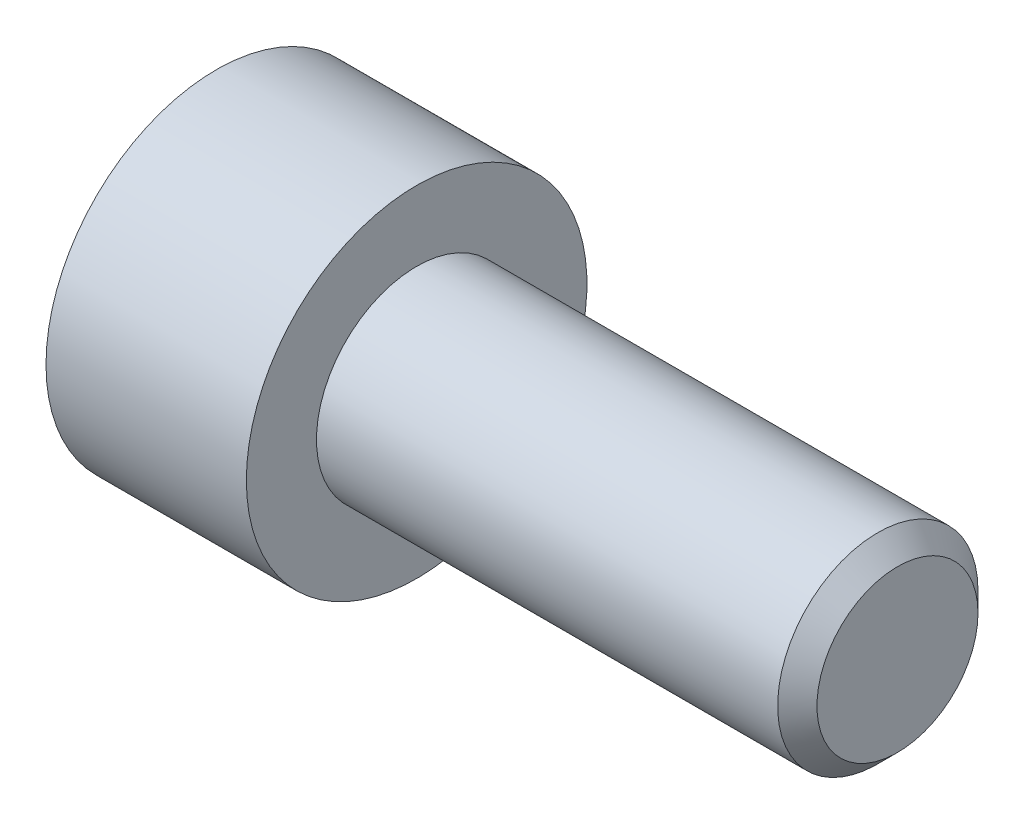
ISO-10303-21;
HEADER;
FILE_DESCRIPTION(('STEP AP214'),'2;1');
FILE_NAME('part.step','',(''),(''),'','','');
FILE_SCHEMA(('AUTOMOTIVE_DESIGN { 1 0 10303 214 1 1 1 1 }'));
ENDSEC;
DATA;
#1=APPLICATION_CONTEXT('core data for automotive mechanical design processes');
#2=APPLICATION_PROTOCOL_DEFINITION('international standard','automotive_design',2000,#1);
#3=PRODUCT_CONTEXT('',#1,'mechanical');
#4=PRODUCT('Part','Part','',(#3));
#5=PRODUCT_RELATED_PRODUCT_CATEGORY('part','',(#4));
#6=PRODUCT_DEFINITION_FORMATION('','',#4);
#7=PRODUCT_DEFINITION_CONTEXT('part definition',#1,'design');
#8=PRODUCT_DEFINITION('design','',#6,#7);
#9=PRODUCT_DEFINITION_SHAPE('','',#8);
#10=(LENGTH_UNIT() NAMED_UNIT(*) SI_UNIT(.MILLI.,.METRE.));
#11=(NAMED_UNIT(*) PLANE_ANGLE_UNIT() SI_UNIT($,.RADIAN.));
#12=(NAMED_UNIT(*) SI_UNIT($,.STERADIAN.) SOLID_ANGLE_UNIT());
#13=UNCERTAINTY_MEASURE_WITH_UNIT(LENGTH_MEASURE(1.E-05),#10,'distance_accuracy_value','');
#14=(GEOMETRIC_REPRESENTATION_CONTEXT(3) GLOBAL_UNCERTAINTY_ASSIGNED_CONTEXT((#13)) GLOBAL_UNIT_ASSIGNED_CONTEXT((#10,
#11,#12)) REPRESENTATION_CONTEXT('',''));
#15=CARTESIAN_POINT('',(0.,0.,0.));
#16=DIRECTION('',(0.,0.,1.));
#17=DIRECTION('',(1.,0.,0.));
#18=AXIS2_PLACEMENT_3D('',#15,#16,#17);
#19=CARTESIAN_POINT('',(0.,0.,0.));
#20=DIRECTION('',(-1.,0.,0.));
#21=DIRECTION('',(0.,0.,1.));
#22=AXIS2_PLACEMENT_3D('',#19,#20,#21);
#23=CYLINDRICAL_SURFACE('',#22,4.25);
#24=CARTESIAN_POINT('',(0.,0.,0.));
#25=DIRECTION('',(-1.,0.,0.));
#26=DIRECTION('',(0.,0.,1.));
#27=AXIS2_PLACEMENT_3D('',#24,#25,#26);
#28=CIRCLE('',#27,4.25);
#29=CARTESIAN_POINT('',(0.,0.,4.25));
#30=VERTEX_POINT('',#29);
#31=EDGE_CURVE('E149',#30,#30,#28,.T.);
#32=ORIENTED_EDGE('',*,*,#31,.T.);
#33=EDGE_LOOP('',(#32));
#34=FACE_BOUND('',#33,.T.);
#35=CARTESIAN_POINT('',(-5.,0.,0.));
#36=DIRECTION('',(-1.,0.,0.));
#37=DIRECTION('',(0.,0.,1.));
#38=AXIS2_PLACEMENT_3D('',#35,#36,#37);
#39=CIRCLE('',#38,4.25);
#40=CARTESIAN_POINT('',(-5.,0.,4.25));
#41=VERTEX_POINT('',#40);
#42=EDGE_CURVE('E146',#41,#41,#39,.T.);
#43=ORIENTED_EDGE('',*,*,#42,.F.);
#44=EDGE_LOOP('',(#43));
#45=FACE_BOUND('',#44,.T.);
#46=ADVANCED_FACE('F33',(#34,#45),#23,.T.);
#47=CARTESIAN_POINT('',(0.,4.25,0.));
#48=DIRECTION('',(1.,0.,0.));
#49=DIRECTION('',(0.,0.,-1.));
#50=AXIS2_PLACEMENT_3D('',#47,#48,#49);
#51=PLANE('',#50);
#52=CARTESIAN_POINT('',(0.,0.,0.));
#53=DIRECTION('',(1.,0.,0.));
#54=DIRECTION('',(0.,0.,-1.));
#55=AXIS2_PLACEMENT_3D('',#52,#53,#54);
#56=CIRCLE('',#55,2.5);
#57=CARTESIAN_POINT('',(0.,0.,-2.5));
#58=VERTEX_POINT('',#57);
#59=EDGE_CURVE('E138',#58,#58,#56,.T.);
#60=ORIENTED_EDGE('',*,*,#59,.F.);
#61=EDGE_LOOP('',(#60));
#62=FACE_BOUND('',#61,.T.);
#63=ORIENTED_EDGE('',*,*,#31,.F.);
#64=EDGE_LOOP('',(#63));
#65=FACE_BOUND('',#64,.T.);
#66=ADVANCED_FACE('F166',(#62,#65),#51,.T.);
#67=CARTESIAN_POINT('',(-5.,0.,0.));
#68=DIRECTION('',(-1.,0.,0.));
#69=DIRECTION('',(0.,0.,1.));
#70=AXIS2_PLACEMENT_3D('',#67,#68,#69);
#71=PLANE('',#70);
#72=DIRECTION('',(0.,1.,0.));
#73=VECTOR('',#72,1.);
#74=CARTESIAN_POINT('',(-5.,-1.15470053837925,2.));
#75=LINE('',#74,#73);
#76=CARTESIAN_POINT('',(-5.,-1.15470053837925,2.));
#77=VERTEX_POINT('',#76);
#78=CARTESIAN_POINT('',(-5.,1.15470053837925,2.));
#79=VERTEX_POINT('',#78);
#80=EDGE_CURVE('E48',#77,#79,#75,.T.);
#81=ORIENTED_EDGE('',*,*,#80,.F.);
#82=DIRECTION('',(0.,0.5,0.866025403784439));
#83=VECTOR('',#82,1.);
#84=CARTESIAN_POINT('',(-5.,-2.3094010767585,0.));
#85=LINE('',#84,#83);
#86=CARTESIAN_POINT('',(-5.,-2.3094010767585,0.));
#87=VERTEX_POINT('',#86);
#88=EDGE_CURVE('E134',#87,#77,#85,.T.);
#89=ORIENTED_EDGE('',*,*,#88,.F.);
#90=DIRECTION('',(0.,-0.5,0.866025403784439));
#91=VECTOR('',#90,1.);
#92=CARTESIAN_POINT('',(-5.,-1.15470053837925,-2.));
#93=LINE('',#92,#91);
#94=CARTESIAN_POINT('',(-5.,-1.15470053837925,-2.));
#95=VERTEX_POINT('',#94);
#96=EDGE_CURVE('E132',#95,#87,#93,.T.);
#97=ORIENTED_EDGE('',*,*,#96,.F.);
#98=DIRECTION('',(0.,-1.,0.));
#99=VECTOR('',#98,1.);
#100=CARTESIAN_POINT('',(-5.,1.15470053837925,-2.));
#101=LINE('',#100,#99);
#102=CARTESIAN_POINT('',(-5.,1.15470053837925,-2.));
#103=VERTEX_POINT('',#102);
#104=EDGE_CURVE('E98',#103,#95,#101,.T.);
#105=ORIENTED_EDGE('',*,*,#104,.F.);
#106=DIRECTION('',(0.,-0.5,-0.866025403784439));
#107=VECTOR('',#106,1.);
#108=CARTESIAN_POINT('',(-5.,2.3094010767585,0.));
#109=LINE('',#108,#107);
#110=CARTESIAN_POINT('',(-5.,2.3094010767585,0.));
#111=VERTEX_POINT('',#110);
#112=EDGE_CURVE('E128',#111,#103,#109,.T.);
#113=ORIENTED_EDGE('',*,*,#112,.F.);
#114=DIRECTION('',(0.,0.5,-0.866025403784439));
#115=VECTOR('',#114,1.);
#116=CARTESIAN_POINT('',(-5.,1.15470053837925,2.));
#117=LINE('',#116,#115);
#118=EDGE_CURVE('E124',#79,#111,#117,.T.);
#119=ORIENTED_EDGE('',*,*,#118,.F.);
#120=EDGE_LOOP('',(#81,#89,#97,#105,#113,#119));
#121=FACE_BOUND('',#120,.T.);
#122=ORIENTED_EDGE('',*,*,#42,.T.);
#123=EDGE_LOOP('',(#122));
#124=FACE_BOUND('',#123,.T.);
#125=ADVANCED_FACE('F171',(#121,#124),#71,.T.);
#126=CARTESIAN_POINT('',(12.,0.,0.));
#127=DIRECTION('',(-1.,0.,0.));
#128=DIRECTION('',(0.,0.,1.));
#129=AXIS2_PLACEMENT_3D('',#126,#127,#128);
#130=CYLINDRICAL_SURFACE('',#129,2.5);
#131=CARTESIAN_POINT('',(11.5094999999357,0.,0.));
#132=DIRECTION('',(1.,0.,0.));
#133=DIRECTION('',(0.,0.,-1.));
#134=AXIS2_PLACEMENT_3D('',#131,#132,#133);
#135=CIRCLE('',#134,2.5);
#136=CARTESIAN_POINT('',(11.5094999999357,0.,-2.5));
#137=VERTEX_POINT('',#136);
#138=EDGE_CURVE('E11',#137,#137,#135,.F.);
#139=ORIENTED_EDGE('',*,*,#138,.T.);
#140=EDGE_LOOP('',(#139));
#141=FACE_BOUND('',#140,.T.);
#142=ORIENTED_EDGE('',*,*,#59,.T.);
#143=EDGE_LOOP('',(#142));
#144=FACE_BOUND('',#143,.T.);
#145=ADVANCED_FACE('F178',(#141,#144),#130,.T.);
#146=CARTESIAN_POINT('',(12.,0.,0.));
#147=DIRECTION('',(1.,0.,0.));
#148=DIRECTION('',(0.,0.,-1.));
#149=AXIS2_PLACEMENT_3D('',#146,#147,#148);
#150=PLANE('',#149);
#151=CARTESIAN_POINT('',(12.,0.,0.));
#152=DIRECTION('',(1.,0.,0.));
#153=DIRECTION('',(0.,0.,-1.));
#154=AXIS2_PLACEMENT_3D('',#151,#152,#153);
#155=CIRCLE('',#154,2.00949999999256);
#156=CARTESIAN_POINT('',(12.,0.,-2.00949999999256));
#157=VERTEX_POINT('',#156);
#158=EDGE_CURVE('E41',#157,#157,#155,.T.);
#159=ORIENTED_EDGE('',*,*,#158,.T.);
#160=EDGE_LOOP('',(#159));
#161=FACE_BOUND('',#160,.T.);
#162=ADVANCED_FACE('F154',(#161),#150,.T.);
#163=CARTESIAN_POINT('',(-2.5,-1.15470053837925,2.));
#164=DIRECTION('',(0.,0.,1.));
#165=DIRECTION('',(1.,0.,0.));
#166=AXIS2_PLACEMENT_3D('',#163,#164,#165);
#167=PLANE('',#166);
#168=ORIENTED_EDGE('',*,*,#80,.T.);
#169=DIRECTION('',(-1.,0.,0.));
#170=VECTOR('',#169,1.);
#171=CARTESIAN_POINT('',(-2.5,1.15470053837925,2.));
#172=LINE('',#171,#170);
#173=CARTESIAN_POINT('',(-2.5,1.15470053837925,2.));
#174=VERTEX_POINT('',#173);
#175=EDGE_CURVE('E79',#174,#79,#172,.T.);
#176=ORIENTED_EDGE('',*,*,#175,.F.);
#177=DIRECTION('',(0.,1.,0.));
#178=VECTOR('',#177,1.);
#179=CARTESIAN_POINT('',(-2.5,-1.15470053837925,2.));
#180=LINE('',#179,#178);
#181=CARTESIAN_POINT('',(-2.5,-1.15470053837925,2.));
#182=VERTEX_POINT('',#181);
#183=EDGE_CURVE('E136',#182,#174,#180,.T.);
#184=ORIENTED_EDGE('',*,*,#183,.F.);
#185=DIRECTION('',(-1.,0.,0.));
#186=VECTOR('',#185,1.);
#187=CARTESIAN_POINT('',(-2.5,-1.15470053837925,2.));
#188=LINE('',#187,#186);
#189=EDGE_CURVE('E56',#182,#77,#188,.T.);
#190=ORIENTED_EDGE('',*,*,#189,.T.);
#191=EDGE_LOOP('',(#168,#176,#184,#190));
#192=FACE_BOUND('',#191,.T.);
#193=ADVANCED_FACE('F185',(#192),#167,.F.);
#194=CARTESIAN_POINT('',(-2.5,-2.3094010767585,0.));
#195=DIRECTION('',(0.,-0.866025403784439,0.5));
#196=DIRECTION('',(0.,-0.5,-0.866025403784439));
#197=AXIS2_PLACEMENT_3D('',#194,#195,#196);
#198=PLANE('',#197);
#199=ORIENTED_EDGE('',*,*,#88,.T.);
#200=ORIENTED_EDGE('',*,*,#189,.F.);
#201=DIRECTION('',(0.,0.5,0.866025403784439));
#202=VECTOR('',#201,1.);
#203=CARTESIAN_POINT('',(-2.5,-2.3094010767585,0.));
#204=LINE('',#203,#202);
#205=CARTESIAN_POINT('',(-2.5,-2.3094010767585,0.));
#206=VERTEX_POINT('',#205);
#207=EDGE_CURVE('E110',#206,#182,#204,.T.);
#208=ORIENTED_EDGE('',*,*,#207,.F.);
#209=DIRECTION('',(-1.,0.,0.));
#210=VECTOR('',#209,1.);
#211=CARTESIAN_POINT('',(-2.5,-2.3094010767585,0.));
#212=LINE('',#211,#210);
#213=EDGE_CURVE('E102',#206,#87,#212,.T.);
#214=ORIENTED_EDGE('',*,*,#213,.T.);
#215=EDGE_LOOP('',(#199,#200,#208,#214));
#216=FACE_BOUND('',#215,.T.);
#217=ADVANCED_FACE('F188',(#216),#198,.F.);
#218=CARTESIAN_POINT('',(-2.5,-1.15470053837925,-2.));
#219=DIRECTION('',(0.,-0.866025403784439,-0.5));
#220=DIRECTION('',(0.,0.5,-0.866025403784439));
#221=AXIS2_PLACEMENT_3D('',#218,#219,#220);
#222=PLANE('',#221);
#223=ORIENTED_EDGE('',*,*,#96,.T.);
#224=ORIENTED_EDGE('',*,*,#213,.F.);
#225=DIRECTION('',(0.,-0.5,0.866025403784439));
#226=VECTOR('',#225,1.);
#227=CARTESIAN_POINT('',(-2.5,-1.15470053837925,-2.));
#228=LINE('',#227,#226);
#229=CARTESIAN_POINT('',(-2.5,-1.15470053837925,-2.));
#230=VERTEX_POINT('',#229);
#231=EDGE_CURVE('E106',#230,#206,#228,.T.);
#232=ORIENTED_EDGE('',*,*,#231,.F.);
#233=DIRECTION('',(-1.,0.,0.));
#234=VECTOR('',#233,1.);
#235=CARTESIAN_POINT('',(-2.5,-1.15470053837925,-2.));
#236=LINE('',#235,#234);
#237=EDGE_CURVE('E91',#230,#95,#236,.T.);
#238=ORIENTED_EDGE('',*,*,#237,.T.);
#239=EDGE_LOOP('',(#223,#224,#232,#238));
#240=FACE_BOUND('',#239,.T.);
#241=ADVANCED_FACE('F107',(#240),#222,.F.);
#242=CARTESIAN_POINT('',(-2.5,1.15470053837925,-2.));
#243=DIRECTION('',(0.,0.,-1.));
#244=DIRECTION('',(-1.,0.,0.));
#245=AXIS2_PLACEMENT_3D('',#242,#243,#244);
#246=PLANE('',#245);
#247=ORIENTED_EDGE('',*,*,#104,.T.);
#248=ORIENTED_EDGE('',*,*,#237,.F.);
#249=DIRECTION('',(0.,-1.,0.));
#250=VECTOR('',#249,1.);
#251=CARTESIAN_POINT('',(-2.5,1.15470053837925,-2.));
#252=LINE('',#251,#250);
#253=CARTESIAN_POINT('',(-2.5,1.15470053837925,-2.));
#254=VERTEX_POINT('',#253);
#255=EDGE_CURVE('E95',#254,#230,#252,.T.);
#256=ORIENTED_EDGE('',*,*,#255,.F.);
#257=DIRECTION('',(-1.,0.,0.));
#258=VECTOR('',#257,1.);
#259=CARTESIAN_POINT('',(-2.5,1.15470053837925,-2.));
#260=LINE('',#259,#258);
#261=EDGE_CURVE('E103',#254,#103,#260,.T.);
#262=ORIENTED_EDGE('',*,*,#261,.T.);
#263=EDGE_LOOP('',(#247,#248,#256,#262));
#264=FACE_BOUND('',#263,.T.);
#265=ADVANCED_FACE('F93',(#264),#246,.F.);
#266=CARTESIAN_POINT('',(-2.5,2.3094010767585,0.));
#267=DIRECTION('',(0.,0.866025403784439,-0.5));
#268=DIRECTION('',(0.,0.5,0.866025403784439));
#269=AXIS2_PLACEMENT_3D('',#266,#267,#268);
#270=PLANE('',#269);
#271=ORIENTED_EDGE('',*,*,#112,.T.);
#272=ORIENTED_EDGE('',*,*,#261,.F.);
#273=DIRECTION('',(0.,-0.5,-0.866025403784439));
#274=VECTOR('',#273,1.);
#275=CARTESIAN_POINT('',(-2.5,2.3094010767585,0.));
#276=LINE('',#275,#274);
#277=CARTESIAN_POINT('',(-2.5,2.3094010767585,0.));
#278=VERTEX_POINT('',#277);
#279=EDGE_CURVE('E116',#278,#254,#276,.T.);
#280=ORIENTED_EDGE('',*,*,#279,.F.);
#281=DIRECTION('',(-1.,0.,0.));
#282=VECTOR('',#281,1.);
#283=CARTESIAN_POINT('',(-2.5,2.3094010767585,0.));
#284=LINE('',#283,#282);
#285=EDGE_CURVE('E141',#278,#111,#284,.T.);
#286=ORIENTED_EDGE('',*,*,#285,.T.);
#287=EDGE_LOOP('',(#271,#272,#280,#286));
#288=FACE_BOUND('',#287,.T.);
#289=ADVANCED_FACE('F192',(#288),#270,.F.);
#290=CARTESIAN_POINT('',(-2.5,1.15470053837925,2.));
#291=DIRECTION('',(0.,0.866025403784439,0.5));
#292=DIRECTION('',(0.,-0.5,0.866025403784439));
#293=AXIS2_PLACEMENT_3D('',#290,#291,#292);
#294=PLANE('',#293);
#295=ORIENTED_EDGE('',*,*,#118,.T.);
#296=ORIENTED_EDGE('',*,*,#285,.F.);
#297=DIRECTION('',(0.,0.5,-0.866025403784439));
#298=VECTOR('',#297,1.);
#299=CARTESIAN_POINT('',(-2.5,1.15470053837925,2.));
#300=LINE('',#299,#298);
#301=EDGE_CURVE('E118',#174,#278,#300,.T.);
#302=ORIENTED_EDGE('',*,*,#301,.F.);
#303=ORIENTED_EDGE('',*,*,#175,.T.);
#304=EDGE_LOOP('',(#295,#296,#302,#303));
#305=FACE_BOUND('',#304,.T.);
#306=ADVANCED_FACE('F189',(#305),#294,.F.);
#307=CARTESIAN_POINT('',(-2.5,0.,0.));
#308=DIRECTION('',(-1.,0.,0.));
#309=DIRECTION('',(0.,0.,1.));
#310=AXIS2_PLACEMENT_3D('',#307,#308,#309);
#311=PLANE('',#310);
#312=CARTESIAN_POINT('',(-2.49999999999975,0.,0.));
#313=DIRECTION('',(1.,0.,0.));
#314=DIRECTION('',(0.,0.,-1.));
#315=AXIS2_PLACEMENT_3D('',#312,#313,#314);
#316=CIRCLE('',#315,1.98999999997679);
#317=CARTESIAN_POINT('',(-2.49999999999975,0.,-1.98999999997679));
#318=VERTEX_POINT('',#317);
#319=EDGE_CURVE('E125',#318,#318,#316,.T.);
#320=ORIENTED_EDGE('',*,*,#319,.T.);
#321=EDGE_LOOP('',(#320));
#322=FACE_BOUND('',#321,.T.);
#323=ORIENTED_EDGE('',*,*,#183,.T.);
#324=ORIENTED_EDGE('',*,*,#301,.T.);
#325=ORIENTED_EDGE('',*,*,#279,.T.);
#326=ORIENTED_EDGE('',*,*,#255,.T.);
#327=ORIENTED_EDGE('',*,*,#231,.T.);
#328=ORIENTED_EDGE('',*,*,#207,.T.);
#329=EDGE_LOOP('',(#323,#324,#325,#326,#327,#328));
#330=FACE_BOUND('',#329,.T.);
#331=ADVANCED_FACE('F113',(#322,#330),#311,.T.);
#332=CARTESIAN_POINT('',(-1.35107296432579,0.,0.));
#333=DIRECTION('',(-1.,0.,0.));
#334=DIRECTION('',(0.,0.,1.));
#335=AXIS2_PLACEMENT_3D('',#332,#333,#334);
#336=CONICAL_SURFACE('',#335,0.,1.0471975511966);
#337=ORIENTED_EDGE('',*,*,#319,.F.);
#338=EDGE_LOOP('',(#337));
#339=FACE_BOUND('',#338,.T.);
#340=CARTESIAN_POINT('',(-1.35107296432579,0.,0.));
#341=VERTEX_POINT('',#340);
#342=VERTEX_LOOP('',#341);
#343=FACE_BOUND('',#342,.T.);
#344=ADVANCED_FACE('F157',(#339,#343),#336,.F.);
#345=CARTESIAN_POINT('',(12.,0.,0.));
#346=DIRECTION('',(-1.,0.,0.));
#347=DIRECTION('',(0.,0.,1.));
#348=AXIS2_PLACEMENT_3D('',#345,#346,#347);
#349=CONICAL_SURFACE('',#348,2.00949999999256,0.785398163339498);
#350=ORIENTED_EDGE('',*,*,#138,.F.);
#351=EDGE_LOOP('',(#350));
#352=FACE_BOUND('',#351,.T.);
#353=ORIENTED_EDGE('',*,*,#158,.F.);
#354=EDGE_LOOP('',(#353));
#355=FACE_BOUND('',#354,.T.);
#356=ADVANCED_FACE('F35',(#352,#355),#349,.T.);
#357=CLOSED_SHELL('',(#46,#66,#125,#145,#162,#193,#217,#241,#265,#289,#306,#331,#344,#356));
#358=MANIFOLD_SOLID_BREP('B2',#357);
#359=ADVANCED_BREP_SHAPE_REPRESENTATION('',(#18,#358),#14);
#360=SHAPE_DEFINITION_REPRESENTATION(#9,#359);
ENDSEC;
END-ISO-10303-21;
